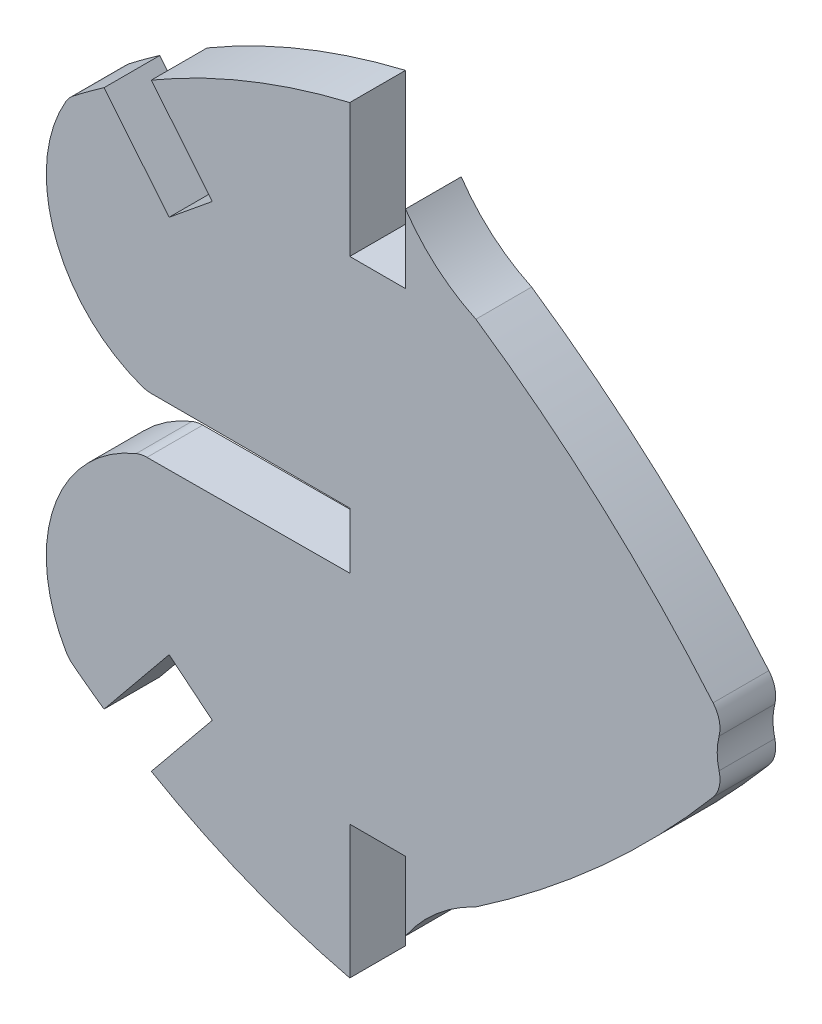
ISO-10303-21;
HEADER;
FILE_DESCRIPTION(('STEP AP214'),'2;1');
FILE_NAME('part.step','',(''),(''),'','','');
FILE_SCHEMA(('AUTOMOTIVE_DESIGN { 1 0 10303 214 1 1 1 1 }'));
ENDSEC;
DATA;
#1=APPLICATION_CONTEXT('core data for automotive mechanical design processes');
#2=APPLICATION_PROTOCOL_DEFINITION('international standard','automotive_design',2000,#1);
#3=PRODUCT_CONTEXT('',#1,'mechanical');
#4=PRODUCT('Part','Part','',(#3));
#5=PRODUCT_RELATED_PRODUCT_CATEGORY('part','',(#4));
#6=PRODUCT_DEFINITION_FORMATION('','',#4);
#7=PRODUCT_DEFINITION_CONTEXT('part definition',#1,'design');
#8=PRODUCT_DEFINITION('design','',#6,#7);
#9=PRODUCT_DEFINITION_SHAPE('','',#8);
#10=(LENGTH_UNIT() NAMED_UNIT(*) SI_UNIT(.MILLI.,.METRE.));
#11=(NAMED_UNIT(*) PLANE_ANGLE_UNIT() SI_UNIT($,.RADIAN.));
#12=(NAMED_UNIT(*) SI_UNIT($,.STERADIAN.) SOLID_ANGLE_UNIT());
#13=UNCERTAINTY_MEASURE_WITH_UNIT(LENGTH_MEASURE(1.E-05),#10,'distance_accuracy_value','');
#14=(GEOMETRIC_REPRESENTATION_CONTEXT(3) GLOBAL_UNCERTAINTY_ASSIGNED_CONTEXT((#13)) GLOBAL_UNIT_ASSIGNED_CONTEXT((#10,
#11,#12)) REPRESENTATION_CONTEXT('',''));
#15=CARTESIAN_POINT('',(0.,0.,0.));
#16=DIRECTION('',(0.,0.,1.));
#17=DIRECTION('',(1.,0.,0.));
#18=AXIS2_PLACEMENT_3D('',#15,#16,#17);
#19=CARTESIAN_POINT('',(70.3517596762299,0.,1.524));
#20=DIRECTION('',(0.,1.,0.));
#21=DIRECTION('',(-1.,0.,0.));
#22=AXIS2_PLACEMENT_3D('',#19,#20,#21);
#23=PLANE('',#22);
#24=DIRECTION('',(1.,0.,0.));
#25=VECTOR('',#24,1.);
#26=CARTESIAN_POINT('',(70.3517596762299,0.,0.));
#27=LINE('',#26,#25);
#28=CARTESIAN_POINT('',(64.9297597579509,0.,0.));
#29=VERTEX_POINT('',#28);
#30=CARTESIAN_POINT('',(70.3517596762299,0.,0.));
#31=VERTEX_POINT('',#30);
#32=EDGE_CURVE('E272',#29,#31,#27,.T.);
#33=ORIENTED_EDGE('',*,*,#32,.T.);
#34=DIRECTION('',(0.,0.,-1.));
#35=VECTOR('',#34,1.);
#36=CARTESIAN_POINT('',(70.3517596762299,0.,1.524));
#37=LINE('',#36,#35);
#38=CARTESIAN_POINT('',(70.3517596762299,0.,1.524));
#39=VERTEX_POINT('',#38);
#40=EDGE_CURVE('E11',#39,#31,#37,.T.);
#41=ORIENTED_EDGE('',*,*,#40,.F.);
#42=DIRECTION('',(1.,0.,0.));
#43=VECTOR('',#42,1.);
#44=CARTESIAN_POINT('',(70.3517596762299,0.,1.524));
#45=LINE('',#44,#43);
#46=CARTESIAN_POINT('',(64.9297597579509,0.,1.524));
#47=VERTEX_POINT('',#46);
#48=EDGE_CURVE('E334',#47,#39,#45,.T.);
#49=ORIENTED_EDGE('',*,*,#48,.F.);
#50=DIRECTION('',(0.,0.,-1.));
#51=VECTOR('',#50,1.);
#52=CARTESIAN_POINT('',(64.9297597579509,0.,1.524));
#53=LINE('',#52,#51);
#54=EDGE_CURVE('E268',#47,#29,#53,.T.);
#55=ORIENTED_EDGE('',*,*,#54,.T.);
#56=EDGE_LOOP('',(#33,#41,#49,#55));
#57=FACE_BOUND('',#56,.T.);
#58=ADVANCED_FACE('F32',(#57),#23,.F.);
#59=CARTESIAN_POINT('',(70.3517596762299,-1.54044228206095,1.524));
#60=DIRECTION('',(1.,0.,0.));
#61=DIRECTION('',(0.,0.,-1.));
#62=AXIS2_PLACEMENT_3D('',#59,#60,#61);
#63=PLANE('',#62);
#64=DIRECTION('',(0.,-1.,0.));
#65=VECTOR('',#64,1.);
#66=CARTESIAN_POINT('',(70.3517596762299,-1.54044228206095,0.));
#67=LINE('',#66,#65);
#68=CARTESIAN_POINT('',(70.3517596762299,-1.54044228206095,0.));
#69=VERTEX_POINT('',#68);
#70=EDGE_CURVE('E275',#31,#69,#67,.T.);
#71=ORIENTED_EDGE('',*,*,#70,.T.);
#72=DIRECTION('',(0.,0.,-1.));
#73=VECTOR('',#72,1.);
#74=CARTESIAN_POINT('',(70.3517596762299,-1.54044228206095,1.524));
#75=LINE('',#74,#73);
#76=CARTESIAN_POINT('',(70.3517596762299,-1.54044228206095,1.524));
#77=VERTEX_POINT('',#76);
#78=EDGE_CURVE('E40',#77,#69,#75,.T.);
#79=ORIENTED_EDGE('',*,*,#78,.F.);
#80=DIRECTION('',(0.,-1.,0.));
#81=VECTOR('',#80,1.);
#82=CARTESIAN_POINT('',(70.3517596762299,-1.54044228206095,1.524));
#83=LINE('',#82,#81);
#84=EDGE_CURVE('E163',#39,#77,#83,.T.);
#85=ORIENTED_EDGE('',*,*,#84,.F.);
#86=ORIENTED_EDGE('',*,*,#40,.T.);
#87=EDGE_LOOP('',(#71,#79,#85,#86));
#88=FACE_BOUND('',#87,.T.);
#89=ADVANCED_FACE('F512',(#88),#63,.F.);
#90=CARTESIAN_POINT('',(70.3517596762299,-1.54044228206095,1.524));
#91=DIRECTION('',(0.00539437100730517,-0.999985450274871,0.));
#92=DIRECTION('',(0.999985450274871,0.00539437100730517,0.));
#93=AXIS2_PLACEMENT_3D('',#90,#91,#92);
#94=PLANE('',#93);
#95=DIRECTION('',(-0.999985450274871,-0.00539437100730517,0.));
#96=VECTOR('',#95,1.);
#97=CARTESIAN_POINT('',(70.3517596762299,-1.54044228206095,0.));
#98=LINE('',#97,#96);
#99=CARTESIAN_POINT('',(64.8048504153923,-1.57036480392223,0.));
#100=VERTEX_POINT('',#99);
#101=EDGE_CURVE('E277',#69,#100,#98,.T.);
#102=ORIENTED_EDGE('',*,*,#101,.T.);
#103=DIRECTION('',(0.,0.,-1.));
#104=VECTOR('',#103,1.);
#105=CARTESIAN_POINT('',(64.8048504153923,-1.57036480392223,1.524));
#106=LINE('',#105,#104);
#107=CARTESIAN_POINT('',(64.8048504153923,-1.57036480392223,1.524));
#108=VERTEX_POINT('',#107);
#109=EDGE_CURVE('E413',#108,#100,#106,.T.);
#110=ORIENTED_EDGE('',*,*,#109,.F.);
#111=DIRECTION('',(-0.999985450274871,-0.00539437100730517,0.));
#112=VECTOR('',#111,1.);
#113=CARTESIAN_POINT('',(70.3517596762299,-1.54044228206095,1.524));
#114=LINE('',#113,#112);
#115=EDGE_CURVE('E421',#77,#108,#114,.T.);
#116=ORIENTED_EDGE('',*,*,#115,.F.);
#117=ORIENTED_EDGE('',*,*,#78,.T.);
#118=EDGE_LOOP('',(#102,#110,#116,#117));
#119=FACE_BOUND('',#118,.T.);
#120=ADVANCED_FACE('F419',(#119),#94,.F.);
#121=CARTESIAN_POINT('',(64.8091321973791,-2.36410325507791,1.524));
#122=DIRECTION('',(0.,0.,-1.));
#123=DIRECTION('',(-1.,0.,0.));
#124=AXIS2_PLACEMENT_3D('',#121,#122,#123);
#125=CYLINDRICAL_SURFACE('',#124,0.793749999999961);
#126=CARTESIAN_POINT('',(64.8091321973791,-2.36410325507791,0.));
#127=DIRECTION('',(0.,0.,1.));
#128=DIRECTION('',(-1.,0.,0.));
#129=AXIS2_PLACEMENT_3D('',#126,#127,#128);
#130=CIRCLE('',#129,0.793749999999961);
#131=CARTESIAN_POINT('',(64.5093015971922,-1.62916062215238,0.));
#132=VERTEX_POINT('',#131);
#133=EDGE_CURVE('E279',#100,#132,#130,.T.);
#134=ORIENTED_EDGE('',*,*,#133,.T.);
#135=DIRECTION('',(0.,0.,-1.));
#136=VECTOR('',#135,1.);
#137=CARTESIAN_POINT('',(64.5093015971922,-1.62916062215238,1.524));
#138=LINE('',#137,#136);
#139=CARTESIAN_POINT('',(64.5093015971922,-1.62916062215238,1.524));
#140=VERTEX_POINT('',#139);
#141=EDGE_CURVE('E410',#140,#132,#138,.T.);
#142=ORIENTED_EDGE('',*,*,#141,.F.);
#143=CARTESIAN_POINT('',(64.8091321973791,-2.36410325507791,1.524));
#144=DIRECTION('',(0.,0.,1.));
#145=DIRECTION('',(-1.,0.,0.));
#146=AXIS2_PLACEMENT_3D('',#143,#144,#145);
#147=CIRCLE('',#146,0.793749999999961);
#148=EDGE_CURVE('E439',#108,#140,#147,.T.);
#149=ORIENTED_EDGE('',*,*,#148,.F.);
#150=ORIENTED_EDGE('',*,*,#109,.T.);
#151=EDGE_LOOP('',(#134,#142,#149,#150));
#152=FACE_BOUND('',#151,.T.);
#153=ADVANCED_FACE('F430',(#152),#125,.T.);
#154=CARTESIAN_POINT('',(66.0008068894287,-5.28512777766143,1.524));
#155=DIRECTION('',(0.,0.,-1.));
#156=DIRECTION('',(-1.,0.,0.));
#157=AXIS2_PLACEMENT_3D('',#154,#155,#156);
#158=CYLINDRICAL_SURFACE('',#157,3.948504005181);
#159=CARTESIAN_POINT('',(66.0008068894287,-5.28512777766143,0.));
#160=DIRECTION('',(0.,0.,1.));
#161=DIRECTION('',(-1.,0.,0.));
#162=AXIS2_PLACEMENT_3D('',#159,#160,#161);
#163=CIRCLE('',#162,3.948504005181);
#164=CARTESIAN_POINT('',(62.5889191130242,-7.27251442352376,0.));
#165=VERTEX_POINT('',#164);
#166=EDGE_CURVE('E281',#132,#165,#163,.T.);
#167=ORIENTED_EDGE('',*,*,#166,.T.);
#168=DIRECTION('',(0.,0.,-1.));
#169=VECTOR('',#168,1.);
#170=CARTESIAN_POINT('',(62.5889191130242,-7.27251442352376,1.524));
#171=LINE('',#170,#169);
#172=CARTESIAN_POINT('',(62.5889191130242,-7.27251442352376,1.524));
#173=VERTEX_POINT('',#172);
#174=EDGE_CURVE('E407',#173,#165,#171,.T.);
#175=ORIENTED_EDGE('',*,*,#174,.F.);
#176=CARTESIAN_POINT('',(66.0008068894287,-5.28512777766143,1.524));
#177=DIRECTION('',(0.,0.,1.));
#178=DIRECTION('',(-1.,0.,0.));
#179=AXIS2_PLACEMENT_3D('',#176,#177,#178);
#180=CIRCLE('',#179,3.948504005181);
#181=EDGE_CURVE('E436',#140,#173,#180,.T.);
#182=ORIENTED_EDGE('',*,*,#181,.F.);
#183=ORIENTED_EDGE('',*,*,#141,.T.);
#184=EDGE_LOOP('',(#167,#175,#182,#183));
#185=FACE_BOUND('',#184,.T.);
#186=ADVANCED_FACE('F434',(#185),#158,.T.);
#187=CARTESIAN_POINT('',(63.2747955662072,-6.87299902523613,1.524));
#188=DIRECTION('',(0.,0.,-1.));
#189=DIRECTION('',(-1.,0.,0.));
#190=AXIS2_PLACEMENT_3D('',#187,#188,#189);
#191=CYLINDRICAL_SURFACE('',#190,0.793749999999911);
#192=CARTESIAN_POINT('',(63.2747955662072,-6.87299902523613,0.));
#193=DIRECTION('',(0.,0.,1.));
#194=DIRECTION('',(1.,0.,0.));
#195=AXIS2_PLACEMENT_3D('',#192,#193,#194);
#196=CIRCLE('',#195,0.793749999999911);
#197=CARTESIAN_POINT('',(62.7882508910903,-7.50014601089041,0.));
#198=VERTEX_POINT('',#197);
#199=EDGE_CURVE('E283',#165,#198,#196,.T.);
#200=ORIENTED_EDGE('',*,*,#199,.T.);
#201=DIRECTION('',(0.,0.,-1.));
#202=VECTOR('',#201,1.);
#203=CARTESIAN_POINT('',(62.7882508910903,-7.50014601089041,1.524));
#204=LINE('',#203,#202);
#205=CARTESIAN_POINT('',(62.7882508910903,-7.50014601089041,1.524));
#206=VERTEX_POINT('',#205);
#207=EDGE_CURVE('E404',#206,#198,#204,.T.);
#208=ORIENTED_EDGE('',*,*,#207,.F.);
#209=CARTESIAN_POINT('',(63.2747955662072,-6.87299902523613,1.524));
#210=DIRECTION('',(0.,0.,1.));
#211=DIRECTION('',(1.,0.,0.));
#212=AXIS2_PLACEMENT_3D('',#209,#210,#211);
#213=CIRCLE('',#212,0.793749999999911);
#214=EDGE_CURVE('E438',#173,#206,#213,.T.);
#215=ORIENTED_EDGE('',*,*,#214,.F.);
#216=ORIENTED_EDGE('',*,*,#174,.T.);
#217=EDGE_LOOP('',(#200,#208,#215,#216));
#218=FACE_BOUND('',#217,.T.);
#219=ADVANCED_FACE('F525',(#218),#191,.T.);
#220=CARTESIAN_POINT('',(74.9681905245007,8.19956835410937,1.524));
#221=DIRECTION('',(0.,0.,-1.));
#222=DIRECTION('',(-1.,0.,0.));
#223=AXIS2_PLACEMENT_3D('',#220,#221,#222);
#224=CYLINDRICAL_SURFACE('',#223,19.8703789751504);
#225=CARTESIAN_POINT('',(74.9681905245007,8.19956835410937,0.));
#226=DIRECTION('',(0.,0.,1.));
#227=DIRECTION('',(-1.,0.,0.));
#228=AXIS2_PLACEMENT_3D('',#225,#226,#227);
#229=CIRCLE('',#228,19.8703789751504);
#230=CARTESIAN_POINT('',(63.6315216804938,-8.11949718707355,0.));
#231=VERTEX_POINT('',#230);
#232=EDGE_CURVE('E285',#198,#231,#229,.T.);
#233=ORIENTED_EDGE('',*,*,#232,.T.);
#234=DIRECTION('',(0.,0.,-1.));
#235=VECTOR('',#234,1.);
#236=CARTESIAN_POINT('',(63.6315216804938,-8.11949718707355,1.524));
#237=LINE('',#236,#235);
#238=CARTESIAN_POINT('',(63.6315216804938,-8.11949718707355,1.524));
#239=VERTEX_POINT('',#238);
#240=EDGE_CURVE('E401',#239,#231,#237,.T.);
#241=ORIENTED_EDGE('',*,*,#240,.F.);
#242=CARTESIAN_POINT('',(74.9681905245007,8.19956835410937,1.524));
#243=DIRECTION('',(0.,0.,1.));
#244=DIRECTION('',(-1.,0.,0.));
#245=AXIS2_PLACEMENT_3D('',#242,#243,#244);
#246=CIRCLE('',#245,19.8703789751504);
#247=EDGE_CURVE('E441',#206,#239,#246,.T.);
#248=ORIENTED_EDGE('',*,*,#247,.F.);
#249=ORIENTED_EDGE('',*,*,#207,.T.);
#250=EDGE_LOOP('',(#233,#241,#248,#249));
#251=FACE_BOUND('',#250,.T.);
#252=ADVANCED_FACE('F528',(#251),#224,.T.);
#253=CARTESIAN_POINT('',(63.6315216804938,-8.11949718707355,1.524));
#254=DIRECTION('',(-0.774608961273237,0.632440477132194,0.));
#255=DIRECTION('',(-0.632440477132194,-0.774608961273237,0.));
#256=AXIS2_PLACEMENT_3D('',#253,#254,#255);
#257=PLANE('',#256);
#258=DIRECTION('',(0.632440477132194,0.774608961273237,0.));
#259=VECTOR('',#258,1.);
#260=CARTESIAN_POINT('',(63.6315216804938,-8.11949718707355,0.));
#261=LINE('',#260,#259);
#262=CARTESIAN_POINT('',(65.410554860862,-5.94054897970317,0.));
#263=VERTEX_POINT('',#262);
#264=EDGE_CURVE('E287',#231,#263,#261,.T.);
#265=ORIENTED_EDGE('',*,*,#264,.T.);
#266=DIRECTION('',(0.,0.,-1.));
#267=VECTOR('',#266,1.);
#268=CARTESIAN_POINT('',(65.410554860862,-5.94054897970317,1.524));
#269=LINE('',#268,#267);
#270=CARTESIAN_POINT('',(65.410554860862,-5.94054897970317,1.524));
#271=VERTEX_POINT('',#270);
#272=EDGE_CURVE('E398',#271,#263,#269,.T.);
#273=ORIENTED_EDGE('',*,*,#272,.F.);
#274=DIRECTION('',(0.632440477132194,0.774608961273237,0.));
#275=VECTOR('',#274,1.);
#276=CARTESIAN_POINT('',(63.6315216804938,-8.11949718707355,1.524));
#277=LINE('',#276,#275);
#278=EDGE_CURVE('E447',#239,#271,#277,.T.);
#279=ORIENTED_EDGE('',*,*,#278,.F.);
#280=ORIENTED_EDGE('',*,*,#240,.T.);
#281=EDGE_LOOP('',(#265,#273,#279,#280));
#282=FACE_BOUND('',#281,.T.);
#283=ADVANCED_FACE('F532',(#282),#257,.F.);
#284=CARTESIAN_POINT('',(65.410554860862,-5.94054897970317,1.524));
#285=DIRECTION('',(0.632440477132194,0.774608961273237,0.));
#286=DIRECTION('',(-0.774608961273237,0.632440477132194,0.));
#287=AXIS2_PLACEMENT_3D('',#284,#285,#286);
#288=PLANE('',#287);
#289=DIRECTION('',(0.774608961273237,-0.632440477132194,0.));
#290=VECTOR('',#289,1.);
#291=CARTESIAN_POINT('',(65.410554860862,-5.94054897970317,0.));
#292=LINE('',#291,#290);
#293=CARTESIAN_POINT('',(66.5910589178424,-6.90438826685263,0.));
#294=VERTEX_POINT('',#293);
#295=EDGE_CURVE('E289',#263,#294,#292,.T.);
#296=ORIENTED_EDGE('',*,*,#295,.T.);
#297=DIRECTION('',(0.,0.,-1.));
#298=VECTOR('',#297,1.);
#299=CARTESIAN_POINT('',(66.5910589178424,-6.90438826685263,1.524));
#300=LINE('',#299,#298);
#301=CARTESIAN_POINT('',(66.5910589178424,-6.90438826685263,1.524));
#302=VERTEX_POINT('',#301);
#303=EDGE_CURVE('E395',#302,#294,#300,.T.);
#304=ORIENTED_EDGE('',*,*,#303,.F.);
#305=DIRECTION('',(0.774608961273237,-0.632440477132194,0.));
#306=VECTOR('',#305,1.);
#307=CARTESIAN_POINT('',(65.410554860862,-5.94054897970317,1.524));
#308=LINE('',#307,#306);
#309=EDGE_CURVE('E449',#271,#302,#308,.T.);
#310=ORIENTED_EDGE('',*,*,#309,.F.);
#311=ORIENTED_EDGE('',*,*,#272,.T.);
#312=EDGE_LOOP('',(#296,#304,#310,#311));
#313=FACE_BOUND('',#312,.T.);
#314=ADVANCED_FACE('F536',(#313),#288,.F.);
#315=CARTESIAN_POINT('',(64.9244972195025,-8.94558213841285,1.524));
#316=DIRECTION('',(0.774608961273239,-0.632440477132191,0.));
#317=DIRECTION('',(0.632440477132191,0.774608961273239,0.));
#318=AXIS2_PLACEMENT_3D('',#315,#316,#317);
#319=PLANE('',#318);
#320=DIRECTION('',(-0.632440477132191,-0.774608961273239,0.));
#321=VECTOR('',#320,1.);
#322=CARTESIAN_POINT('',(64.9244972195025,-8.94558213841285,0.));
#323=LINE('',#322,#321);
#324=CARTESIAN_POINT('',(64.9244972195025,-8.94558213841285,0.));
#325=VERTEX_POINT('',#324);
#326=EDGE_CURVE('E291',#294,#325,#323,.T.);
#327=ORIENTED_EDGE('',*,*,#326,.T.);
#328=DIRECTION('',(0.,0.,-1.));
#329=VECTOR('',#328,1.);
#330=CARTESIAN_POINT('',(64.9244972195025,-8.94558213841285,1.524));
#331=LINE('',#330,#329);
#332=CARTESIAN_POINT('',(64.9244972195025,-8.94558213841285,1.524));
#333=VERTEX_POINT('',#332);
#334=EDGE_CURVE('E392',#333,#325,#331,.T.);
#335=ORIENTED_EDGE('',*,*,#334,.F.);
#336=DIRECTION('',(-0.632440477132191,-0.774608961273239,0.));
#337=VECTOR('',#336,1.);
#338=CARTESIAN_POINT('',(64.9244972195025,-8.94558213841285,1.524));
#339=LINE('',#338,#337);
#340=EDGE_CURVE('E451',#302,#333,#339,.T.);
#341=ORIENTED_EDGE('',*,*,#340,.F.);
#342=ORIENTED_EDGE('',*,*,#303,.T.);
#343=EDGE_LOOP('',(#327,#335,#341,#342));
#344=FACE_BOUND('',#343,.T.);
#345=ADVANCED_FACE('F540',(#344),#319,.F.);
#346=CARTESIAN_POINT('',(74.9681905245007,8.19956835410937,1.524));
#347=DIRECTION('',(0.,0.,-1.));
#348=DIRECTION('',(-1.,0.,0.));
#349=AXIS2_PLACEMENT_3D('',#346,#347,#348);
#350=CYLINDRICAL_SURFACE('',#349,19.8703789751504);
#351=CARTESIAN_POINT('',(74.9681905245007,8.19956835410937,0.));
#352=DIRECTION('',(0.,0.,1.));
#353=DIRECTION('',(-1.,0.,0.));
#354=AXIS2_PLACEMENT_3D('',#351,#352,#353);
#355=CIRCLE('',#354,19.8703789751504);
#356=CARTESIAN_POINT('',(70.349637053648,-11.1266036531189,0.));
#357=VERTEX_POINT('',#356);
#358=EDGE_CURVE('E293',#325,#357,#355,.T.);
#359=ORIENTED_EDGE('',*,*,#358,.T.);
#360=DIRECTION('',(0.,0.,-1.));
#361=VECTOR('',#360,1.);
#362=CARTESIAN_POINT('',(70.349637053648,-11.1266036531189,1.524));
#363=LINE('',#362,#361);
#364=CARTESIAN_POINT('',(70.349637053648,-11.1266036531189,1.524));
#365=VERTEX_POINT('',#364);
#366=EDGE_CURVE('E389',#365,#357,#363,.T.);
#367=ORIENTED_EDGE('',*,*,#366,.F.);
#368=CARTESIAN_POINT('',(74.9681905245007,8.19956835410937,1.524));
#369=DIRECTION('',(0.,0.,1.));
#370=DIRECTION('',(-1.,0.,0.));
#371=AXIS2_PLACEMENT_3D('',#368,#369,#370);
#372=CIRCLE('',#371,19.8703789751504);
#373=EDGE_CURVE('E453',#333,#365,#372,.T.);
#374=ORIENTED_EDGE('',*,*,#373,.F.);
#375=ORIENTED_EDGE('',*,*,#334,.T.);
#376=EDGE_LOOP('',(#359,#367,#374,#375));
#377=FACE_BOUND('',#376,.T.);
#378=ADVANCED_FACE('F544',(#377),#350,.T.);
#379=CARTESIAN_POINT('',(70.349637053648,-11.1266036531189,1.524));
#380=DIRECTION('',(-1.,0.,0.));
#381=DIRECTION('',(0.,0.,1.));
#382=AXIS2_PLACEMENT_3D('',#379,#380,#381);
#383=PLANE('',#382);
#384=DIRECTION('',(0.,1.,0.));
#385=VECTOR('',#384,1.);
#386=CARTESIAN_POINT('',(70.349637053648,-11.1266036531189,0.));
#387=LINE('',#386,#385);
#388=CARTESIAN_POINT('',(70.349637053648,-7.48296754921924,0.));
#389=VERTEX_POINT('',#388);
#390=EDGE_CURVE('E295',#357,#389,#387,.T.);
#391=ORIENTED_EDGE('',*,*,#390,.T.);
#392=DIRECTION('',(0.,0.,-1.));
#393=VECTOR('',#392,1.);
#394=CARTESIAN_POINT('',(70.349637053648,-7.48296754921924,1.524));
#395=LINE('',#394,#393);
#396=CARTESIAN_POINT('',(70.349637053648,-7.48296754921924,1.524));
#397=VERTEX_POINT('',#396);
#398=EDGE_CURVE('E386',#397,#389,#395,.T.);
#399=ORIENTED_EDGE('',*,*,#398,.F.);
#400=DIRECTION('',(0.,1.,0.));
#401=VECTOR('',#400,1.);
#402=CARTESIAN_POINT('',(70.349637053648,-11.1266036531189,1.524));
#403=LINE('',#402,#401);
#404=EDGE_CURVE('E455',#365,#397,#403,.T.);
#405=ORIENTED_EDGE('',*,*,#404,.F.);
#406=ORIENTED_EDGE('',*,*,#366,.T.);
#407=EDGE_LOOP('',(#391,#399,#405,#406));
#408=FACE_BOUND('',#407,.T.);
#409=ADVANCED_FACE('F548',(#408),#383,.F.);
#410=CARTESIAN_POINT('',(71.873637053648,-7.48296754921924,1.524));
#411=DIRECTION('',(0.,1.,0.));
#412=DIRECTION('',(0.,0.,1.));
#413=AXIS2_PLACEMENT_3D('',#410,#411,#412);
#414=PLANE('',#413);
#415=DIRECTION('',(1.,0.,0.));
#416=VECTOR('',#415,1.);
#417=CARTESIAN_POINT('',(71.873637053648,-7.48296754921924,0.));
#418=LINE('',#417,#416);
#419=CARTESIAN_POINT('',(71.873637053648,-7.48296754921924,0.));
#420=VERTEX_POINT('',#419);
#421=EDGE_CURVE('E297',#389,#420,#418,.T.);
#422=ORIENTED_EDGE('',*,*,#421,.T.);
#423=DIRECTION('',(0.,0.,-1.));
#424=VECTOR('',#423,1.);
#425=CARTESIAN_POINT('',(71.873637053648,-7.48296754921924,1.524));
#426=LINE('',#425,#424);
#427=CARTESIAN_POINT('',(71.873637053648,-7.48296754921924,1.524));
#428=VERTEX_POINT('',#427);
#429=EDGE_CURVE('E383',#428,#420,#426,.T.);
#430=ORIENTED_EDGE('',*,*,#429,.F.);
#431=DIRECTION('',(1.,0.,0.));
#432=VECTOR('',#431,1.);
#433=CARTESIAN_POINT('',(71.873637053648,-7.48296754921924,1.524));
#434=LINE('',#433,#432);
#435=EDGE_CURVE('E457',#397,#428,#434,.T.);
#436=ORIENTED_EDGE('',*,*,#435,.F.);
#437=ORIENTED_EDGE('',*,*,#398,.T.);
#438=EDGE_LOOP('',(#422,#430,#436,#437));
#439=FACE_BOUND('',#438,.T.);
#440=ADVANCED_FACE('F552',(#439),#414,.F.);
#441=CARTESIAN_POINT('',(71.873637053648,-9.36835651136685,1.524));
#442=DIRECTION('',(1.,0.,0.));
#443=DIRECTION('',(0.,0.,-1.));
#444=AXIS2_PLACEMENT_3D('',#441,#442,#443);
#445=PLANE('',#444);
#446=DIRECTION('',(0.,-1.,0.));
#447=VECTOR('',#446,1.);
#448=CARTESIAN_POINT('',(71.873637053648,-9.36835651136685,0.));
#449=LINE('',#448,#447);
#450=CARTESIAN_POINT('',(71.873637053648,-9.36835651136685,0.));
#451=VERTEX_POINT('',#450);
#452=EDGE_CURVE('E299',#420,#451,#449,.T.);
#453=ORIENTED_EDGE('',*,*,#452,.T.);
#454=DIRECTION('',(0.,0.,-1.));
#455=VECTOR('',#454,1.);
#456=CARTESIAN_POINT('',(71.873637053648,-9.36835651136685,1.524));
#457=LINE('',#456,#455);
#458=CARTESIAN_POINT('',(71.873637053648,-9.36835651136685,1.524));
#459=VERTEX_POINT('',#458);
#460=EDGE_CURVE('E380',#459,#451,#457,.T.);
#461=ORIENTED_EDGE('',*,*,#460,.F.);
#462=DIRECTION('',(0.,-1.,0.));
#463=VECTOR('',#462,1.);
#464=CARTESIAN_POINT('',(71.873637053648,-9.36835651136685,1.524));
#465=LINE('',#464,#463);
#466=EDGE_CURVE('E459',#428,#459,#465,.T.);
#467=ORIENTED_EDGE('',*,*,#466,.F.);
#468=ORIENTED_EDGE('',*,*,#429,.T.);
#469=EDGE_LOOP('',(#453,#461,#467,#468));
#470=FACE_BOUND('',#469,.T.);
#471=ADVANCED_FACE('F556',(#470),#445,.F.);
#472=CARTESIAN_POINT('',(75.8398417054369,-12.0518253612268,1.524));
#473=DIRECTION('',(0.,0.,-1.));
#474=DIRECTION('',(-1.,0.,0.));
#475=AXIS2_PLACEMENT_3D('',#472,#473,#474);
#476=CYLINDRICAL_SURFACE('',#475,4.78871427504705);
#477=CARTESIAN_POINT('',(75.8398417054369,-12.0518253612268,0.));
#478=DIRECTION('',(0.,0.,-1.));
#479=DIRECTION('',(1.,0.,0.));
#480=AXIS2_PLACEMENT_3D('',#477,#478,#479);
#481=CIRCLE('',#480,4.78871427504705);
#482=CARTESIAN_POINT('',(73.7975396419488,-7.72045298177108,0.));
#483=VERTEX_POINT('',#482);
#484=EDGE_CURVE('E301',#451,#483,#481,.T.);
#485=ORIENTED_EDGE('',*,*,#484,.T.);
#486=DIRECTION('',(0.,0.,-1.));
#487=VECTOR('',#486,1.);
#488=CARTESIAN_POINT('',(73.7975396419488,-7.72045298177108,1.524));
#489=LINE('',#488,#487);
#490=CARTESIAN_POINT('',(73.7975396419488,-7.72045298177108,1.524));
#491=VERTEX_POINT('',#490);
#492=EDGE_CURVE('E377',#491,#483,#489,.T.);
#493=ORIENTED_EDGE('',*,*,#492,.F.);
#494=CARTESIAN_POINT('',(75.8398417054369,-12.0518253612268,1.524));
#495=DIRECTION('',(0.,0.,-1.));
#496=DIRECTION('',(1.,0.,0.));
#497=AXIS2_PLACEMENT_3D('',#494,#495,#496);
#498=CIRCLE('',#497,4.78871427504705);
#499=EDGE_CURVE('E461',#459,#491,#498,.T.);
#500=ORIENTED_EDGE('',*,*,#499,.F.);
#501=ORIENTED_EDGE('',*,*,#460,.T.);
#502=EDGE_LOOP('',(#485,#493,#500,#501));
#503=FACE_BOUND('',#502,.T.);
#504=ADVANCED_FACE('F560',(#503),#476,.F.);
#505=CARTESIAN_POINT('',(55.604244703539,19.0045916556661,1.524));
#506=DIRECTION('',(0.,0.,-1.));
#507=DIRECTION('',(-1.,0.,0.));
#508=AXIS2_PLACEMENT_3D('',#505,#506,#507);
#509=CYLINDRICAL_SURFACE('',#508,32.3299240888221);
#510=CARTESIAN_POINT('',(55.604244703539,19.0045916556661,0.));
#511=DIRECTION('',(0.,0.,1.));
#512=DIRECTION('',(1.,0.,0.));
#513=AXIS2_PLACEMENT_3D('',#510,#511,#512);
#514=CIRCLE('',#513,32.3299240888221);
#515=CARTESIAN_POINT('',(80.2835558518823,-1.87974680242864,0.));
#516=VERTEX_POINT('',#515);
#517=EDGE_CURVE('E303',#483,#516,#514,.T.);
#518=ORIENTED_EDGE('',*,*,#517,.T.);
#519=DIRECTION('',(0.,0.,-1.));
#520=VECTOR('',#519,1.);
#521=CARTESIAN_POINT('',(80.2835558518823,-1.87974680242864,1.524));
#522=LINE('',#521,#520);
#523=CARTESIAN_POINT('',(80.2835558518823,-1.87974680242864,1.524));
#524=VERTEX_POINT('',#523);
#525=EDGE_CURVE('E374',#524,#516,#522,.T.);
#526=ORIENTED_EDGE('',*,*,#525,.F.);
#527=CARTESIAN_POINT('',(55.604244703539,19.0045916556661,1.524));
#528=DIRECTION('',(0.,0.,1.));
#529=DIRECTION('',(1.,0.,0.));
#530=AXIS2_PLACEMENT_3D('',#527,#528,#529);
#531=CIRCLE('',#530,32.3299240888221);
#532=EDGE_CURVE('E463',#491,#524,#531,.T.);
#533=ORIENTED_EDGE('',*,*,#532,.F.);
#534=ORIENTED_EDGE('',*,*,#492,.T.);
#535=EDGE_LOOP('',(#518,#526,#533,#534));
#536=FACE_BOUND('',#535,.T.);
#537=ADVANCED_FACE('F564',(#536),#509,.T.);
#538=CARTESIAN_POINT('',(79.6776403177111,-1.36700375961889,1.524));
#539=DIRECTION('',(0.,0.,-1.));
#540=DIRECTION('',(-1.,0.,0.));
#541=AXIS2_PLACEMENT_3D('',#538,#539,#540);
#542=CYLINDRICAL_SURFACE('',#541,0.793750000000005);
#543=CARTESIAN_POINT('',(79.6776403177111,-1.36700375961889,0.));
#544=DIRECTION('',(0.,0.,1.));
#545=DIRECTION('',(1.,0.,0.));
#546=AXIS2_PLACEMENT_3D('',#543,#544,#545);
#547=CIRCLE('',#546,0.793750000000005);
#548=CARTESIAN_POINT('',(80.4470170188281,-1.17181525002305,0.));
#549=VERTEX_POINT('',#548);
#550=EDGE_CURVE('E305',#516,#549,#547,.T.);
#551=ORIENTED_EDGE('',*,*,#550,.T.);
#552=DIRECTION('',(0.,0.,-1.));
#553=VECTOR('',#552,1.);
#554=CARTESIAN_POINT('',(80.4470170188281,-1.17181525002305,1.524));
#555=LINE('',#554,#553);
#556=CARTESIAN_POINT('',(80.4470170188281,-1.17181525002305,1.524));
#557=VERTEX_POINT('',#556);
#558=EDGE_CURVE('E371',#557,#549,#555,.T.);
#559=ORIENTED_EDGE('',*,*,#558,.F.);
#560=CARTESIAN_POINT('',(79.6776403177111,-1.36700375961889,1.524));
#561=DIRECTION('',(0.,0.,1.));
#562=DIRECTION('',(1.,0.,0.));
#563=AXIS2_PLACEMENT_3D('',#560,#561,#562);
#564=CIRCLE('',#563,0.793750000000005);
#565=EDGE_CURVE('E465',#524,#557,#564,.T.);
#566=ORIENTED_EDGE('',*,*,#565,.F.);
#567=ORIENTED_EDGE('',*,*,#525,.T.);
#568=EDGE_LOOP('',(#551,#559,#566,#567));
#569=FACE_BOUND('',#568,.T.);
#570=ADVANCED_FACE('F568',(#569),#542,.T.);
#571=CARTESIAN_POINT('',(82.0623903099253,-0.762,1.524));
#572=DIRECTION('',(0.,0.,-1.));
#573=DIRECTION('',(-1.,0.,0.));
#574=AXIS2_PLACEMENT_3D('',#571,#572,#573);
#575=CYLINDRICAL_SURFACE('',#574,1.66654715167071);
#576=CARTESIAN_POINT('',(82.0623903099253,-0.762,0.));
#577=DIRECTION('',(0.,0.,-1.));
#578=DIRECTION('',(-1.,0.,0.));
#579=AXIS2_PLACEMENT_3D('',#576,#577,#578);
#580=CIRCLE('',#579,1.66654715167071);
#581=CARTESIAN_POINT('',(80.4470170188281,-0.352184749976949,0.));
#582=VERTEX_POINT('',#581);
#583=EDGE_CURVE('E307',#549,#582,#580,.T.);
#584=ORIENTED_EDGE('',*,*,#583,.T.);
#585=DIRECTION('',(0.,0.,-1.));
#586=VECTOR('',#585,1.);
#587=CARTESIAN_POINT('',(80.4470170188281,-0.352184749976949,1.524));
#588=LINE('',#587,#586);
#589=CARTESIAN_POINT('',(80.4470170188281,-0.352184749976949,1.524));
#590=VERTEX_POINT('',#589);
#591=EDGE_CURVE('E368',#590,#582,#588,.T.);
#592=ORIENTED_EDGE('',*,*,#591,.F.);
#593=CARTESIAN_POINT('',(82.0623903099253,-0.762,1.524));
#594=DIRECTION('',(0.,0.,-1.));
#595=DIRECTION('',(-1.,0.,0.));
#596=AXIS2_PLACEMENT_3D('',#593,#594,#595);
#597=CIRCLE('',#596,1.66654715167071);
#598=EDGE_CURVE('E467',#557,#590,#597,.T.);
#599=ORIENTED_EDGE('',*,*,#598,.F.);
#600=ORIENTED_EDGE('',*,*,#558,.T.);
#601=EDGE_LOOP('',(#584,#592,#599,#600));
#602=FACE_BOUND('',#601,.T.);
#603=ADVANCED_FACE('F572',(#602),#575,.F.);
#604=CARTESIAN_POINT('',(79.6776403177111,-0.156996240381111,1.524));
#605=DIRECTION('',(0.,0.,-1.));
#606=DIRECTION('',(-1.,0.,0.));
#607=AXIS2_PLACEMENT_3D('',#604,#605,#606);
#608=CYLINDRICAL_SURFACE('',#607,0.793750000000005);
#609=CARTESIAN_POINT('',(79.6776403177111,-0.156996240381111,0.));
#610=DIRECTION('',(0.,0.,1.));
#611=DIRECTION('',(-1.,0.,0.));
#612=AXIS2_PLACEMENT_3D('',#609,#610,#611);
#613=CIRCLE('',#612,0.793750000000005);
#614=CARTESIAN_POINT('',(80.2835558518824,0.355746802428731,0.));
#615=VERTEX_POINT('',#614);
#616=EDGE_CURVE('E309',#582,#615,#613,.T.);
#617=ORIENTED_EDGE('',*,*,#616,.T.);
#618=DIRECTION('',(0.,0.,-1.));
#619=VECTOR('',#618,1.);
#620=CARTESIAN_POINT('',(80.2835558518824,0.355746802428731,1.524));
#621=LINE('',#620,#619);
#622=CARTESIAN_POINT('',(80.2835558518824,0.355746802428731,1.524));
#623=VERTEX_POINT('',#622);
#624=EDGE_CURVE('E365',#623,#615,#621,.T.);
#625=ORIENTED_EDGE('',*,*,#624,.F.);
#626=CARTESIAN_POINT('',(79.6776403177111,-0.156996240381111,1.524));
#627=DIRECTION('',(0.,0.,1.));
#628=DIRECTION('',(-1.,0.,0.));
#629=AXIS2_PLACEMENT_3D('',#626,#627,#628);
#630=CIRCLE('',#629,0.793750000000005);
#631=EDGE_CURVE('E469',#590,#623,#630,.T.);
#632=ORIENTED_EDGE('',*,*,#631,.F.);
#633=ORIENTED_EDGE('',*,*,#591,.T.);
#634=EDGE_LOOP('',(#617,#625,#632,#633));
#635=FACE_BOUND('',#634,.T.);
#636=ADVANCED_FACE('F576',(#635),#608,.T.);
#637=CARTESIAN_POINT('',(55.604244703539,-20.5285916556661,1.524));
#638=DIRECTION('',(0.,0.,-1.));
#639=DIRECTION('',(-1.,0.,0.));
#640=AXIS2_PLACEMENT_3D('',#637,#638,#639);
#641=CYLINDRICAL_SURFACE('',#640,32.3299240888221);
#642=CARTESIAN_POINT('',(55.604244703539,-20.5285916556661,0.));
#643=DIRECTION('',(0.,0.,1.));
#644=DIRECTION('',(-1.,0.,0.));
#645=AXIS2_PLACEMENT_3D('',#642,#643,#644);
#646=CIRCLE('',#645,32.3299240888221);
#647=CARTESIAN_POINT('',(73.797539641949,6.1964529817713,0.));
#648=VERTEX_POINT('',#647);
#649=EDGE_CURVE('E311',#615,#648,#646,.T.);
#650=ORIENTED_EDGE('',*,*,#649,.T.);
#651=DIRECTION('',(0.,0.,-1.));
#652=VECTOR('',#651,1.);
#653=CARTESIAN_POINT('',(73.797539641949,6.1964529817713,1.524));
#654=LINE('',#653,#652);
#655=CARTESIAN_POINT('',(73.797539641949,6.1964529817713,1.524));
#656=VERTEX_POINT('',#655);
#657=EDGE_CURVE('E362',#656,#648,#654,.T.);
#658=ORIENTED_EDGE('',*,*,#657,.F.);
#659=CARTESIAN_POINT('',(55.604244703539,-20.5285916556661,1.524));
#660=DIRECTION('',(0.,0.,1.));
#661=DIRECTION('',(-1.,0.,0.));
#662=AXIS2_PLACEMENT_3D('',#659,#660,#661);
#663=CIRCLE('',#662,32.3299240888221);
#664=EDGE_CURVE('E471',#623,#656,#663,.T.);
#665=ORIENTED_EDGE('',*,*,#664,.F.);
#666=ORIENTED_EDGE('',*,*,#624,.T.);
#667=EDGE_LOOP('',(#650,#658,#665,#666));
#668=FACE_BOUND('',#667,.T.);
#669=ADVANCED_FACE('F580',(#668),#641,.T.);
#670=CARTESIAN_POINT('',(75.8398417054369,10.5278253612268,1.524));
#671=DIRECTION('',(0.,0.,-1.));
#672=DIRECTION('',(-1.,0.,0.));
#673=AXIS2_PLACEMENT_3D('',#670,#671,#672);
#674=CYLINDRICAL_SURFACE('',#673,4.78871427504705);
#675=CARTESIAN_POINT('',(75.8398417054369,10.5278253612268,0.));
#676=DIRECTION('',(0.,0.,-1.));
#677=DIRECTION('',(-1.,0.,0.));
#678=AXIS2_PLACEMENT_3D('',#675,#676,#677);
#679=CIRCLE('',#678,4.78871427504705);
#680=CARTESIAN_POINT('',(71.8736370536481,7.8443565113669,0.));
#681=VERTEX_POINT('',#680);
#682=EDGE_CURVE('E313',#648,#681,#679,.T.);
#683=ORIENTED_EDGE('',*,*,#682,.T.);
#684=DIRECTION('',(0.,0.,-1.));
#685=VECTOR('',#684,1.);
#686=CARTESIAN_POINT('',(71.8736370536481,7.8443565113669,1.524));
#687=LINE('',#686,#685);
#688=CARTESIAN_POINT('',(71.8736370536481,7.8443565113669,1.524));
#689=VERTEX_POINT('',#688);
#690=EDGE_CURVE('E359',#689,#681,#687,.T.);
#691=ORIENTED_EDGE('',*,*,#690,.F.);
#692=CARTESIAN_POINT('',(75.8398417054369,10.5278253612268,1.524));
#693=DIRECTION('',(0.,0.,-1.));
#694=DIRECTION('',(-1.,0.,0.));
#695=AXIS2_PLACEMENT_3D('',#692,#693,#694);
#696=CIRCLE('',#695,4.78871427504705);
#697=EDGE_CURVE('E473',#656,#689,#696,.T.);
#698=ORIENTED_EDGE('',*,*,#697,.F.);
#699=ORIENTED_EDGE('',*,*,#657,.T.);
#700=EDGE_LOOP('',(#683,#691,#698,#699));
#701=FACE_BOUND('',#700,.T.);
#702=ADVANCED_FACE('F584',(#701),#674,.F.);
#703=CARTESIAN_POINT('',(71.873637053648,7.84435651136683,1.524));
#704=DIRECTION('',(1.,0.,0.));
#705=DIRECTION('',(0.,0.,-1.));
#706=AXIS2_PLACEMENT_3D('',#703,#704,#705);
#707=PLANE('',#706);
#708=DIRECTION('',(0.,-1.,0.));
#709=VECTOR('',#708,1.);
#710=CARTESIAN_POINT('',(71.873637053648,7.84435651136683,0.));
#711=LINE('',#710,#709);
#712=CARTESIAN_POINT('',(71.873637053648,5.95896754921924,0.));
#713=VERTEX_POINT('',#712);
#714=EDGE_CURVE('E315',#681,#713,#711,.T.);
#715=ORIENTED_EDGE('',*,*,#714,.T.);
#716=DIRECTION('',(0.,0.,-1.));
#717=VECTOR('',#716,1.);
#718=CARTESIAN_POINT('',(71.873637053648,5.95896754921924,1.524));
#719=LINE('',#718,#717);
#720=CARTESIAN_POINT('',(71.873637053648,5.95896754921924,1.524));
#721=VERTEX_POINT('',#720);
#722=EDGE_CURVE('E356',#721,#713,#719,.T.);
#723=ORIENTED_EDGE('',*,*,#722,.F.);
#724=DIRECTION('',(0.,-1.,0.));
#725=VECTOR('',#724,1.);
#726=CARTESIAN_POINT('',(71.873637053648,7.84435651136683,1.524));
#727=LINE('',#726,#725);
#728=EDGE_CURVE('E475',#689,#721,#727,.T.);
#729=ORIENTED_EDGE('',*,*,#728,.F.);
#730=ORIENTED_EDGE('',*,*,#690,.T.);
#731=EDGE_LOOP('',(#715,#723,#729,#730));
#732=FACE_BOUND('',#731,.T.);
#733=ADVANCED_FACE('F588',(#732),#707,.F.);
#734=CARTESIAN_POINT('',(70.349637053648,5.95896754921924,1.524));
#735=DIRECTION('',(0.,-1.,0.));
#736=DIRECTION('',(0.,0.,-1.));
#737=AXIS2_PLACEMENT_3D('',#734,#735,#736);
#738=PLANE('',#737);
#739=DIRECTION('',(-1.,0.,0.));
#740=VECTOR('',#739,1.);
#741=CARTESIAN_POINT('',(70.349637053648,5.95896754921924,0.));
#742=LINE('',#741,#740);
#743=CARTESIAN_POINT('',(70.349637053648,5.95896754921924,0.));
#744=VERTEX_POINT('',#743);
#745=EDGE_CURVE('E317',#713,#744,#742,.T.);
#746=ORIENTED_EDGE('',*,*,#745,.T.);
#747=DIRECTION('',(0.,0.,-1.));
#748=VECTOR('',#747,1.);
#749=CARTESIAN_POINT('',(70.349637053648,5.95896754921924,1.524));
#750=LINE('',#749,#748);
#751=CARTESIAN_POINT('',(70.349637053648,5.95896754921924,1.524));
#752=VERTEX_POINT('',#751);
#753=EDGE_CURVE('E353',#752,#744,#750,.T.);
#754=ORIENTED_EDGE('',*,*,#753,.F.);
#755=DIRECTION('',(-1.,0.,0.));
#756=VECTOR('',#755,1.);
#757=CARTESIAN_POINT('',(70.349637053648,5.95896754921924,1.524));
#758=LINE('',#757,#756);
#759=EDGE_CURVE('E477',#721,#752,#758,.T.);
#760=ORIENTED_EDGE('',*,*,#759,.F.);
#761=ORIENTED_EDGE('',*,*,#722,.T.);
#762=EDGE_LOOP('',(#746,#754,#760,#761));
#763=FACE_BOUND('',#762,.T.);
#764=ADVANCED_FACE('F592',(#763),#738,.F.);
#765=CARTESIAN_POINT('',(70.349637053648,9.60260365312138,1.524));
#766=DIRECTION('',(-1.,0.,0.));
#767=DIRECTION('',(0.,0.,1.));
#768=AXIS2_PLACEMENT_3D('',#765,#766,#767);
#769=PLANE('',#768);
#770=DIRECTION('',(0.,1.,0.));
#771=VECTOR('',#770,1.);
#772=CARTESIAN_POINT('',(70.349637053648,9.60260365312138,0.));
#773=LINE('',#772,#771);
#774=CARTESIAN_POINT('',(70.349637053648,9.60260365312138,0.));
#775=VERTEX_POINT('',#774);
#776=EDGE_CURVE('E319',#744,#775,#773,.T.);
#777=ORIENTED_EDGE('',*,*,#776,.T.);
#778=DIRECTION('',(0.,0.,-1.));
#779=VECTOR('',#778,1.);
#780=CARTESIAN_POINT('',(70.349637053648,9.60260365312138,1.524));
#781=LINE('',#780,#779);
#782=CARTESIAN_POINT('',(70.349637053648,9.60260365312138,1.524));
#783=VERTEX_POINT('',#782);
#784=EDGE_CURVE('E350',#783,#775,#781,.T.);
#785=ORIENTED_EDGE('',*,*,#784,.F.);
#786=DIRECTION('',(0.,1.,0.));
#787=VECTOR('',#786,1.);
#788=CARTESIAN_POINT('',(70.349637053648,9.60260365312138,1.524));
#789=LINE('',#788,#787);
#790=EDGE_CURVE('E479',#752,#783,#789,.T.);
#791=ORIENTED_EDGE('',*,*,#790,.F.);
#792=ORIENTED_EDGE('',*,*,#753,.T.);
#793=EDGE_LOOP('',(#777,#785,#791,#792));
#794=FACE_BOUND('',#793,.T.);
#795=ADVANCED_FACE('F596',(#794),#769,.F.);
#796=CARTESIAN_POINT('',(74.9681905245245,-9.72356835414677,1.524));
#797=DIRECTION('',(0.,0.,-1.));
#798=DIRECTION('',(-1.,0.,0.));
#799=AXIS2_PLACEMENT_3D('',#796,#797,#798);
#800=CYLINDRICAL_SURFACE('',#799,19.8703789751947);
#801=CARTESIAN_POINT('',(74.9681905245245,-9.72356835414677,0.));
#802=DIRECTION('',(0.,0.,1.));
#803=DIRECTION('',(1.,0.,0.));
#804=AXIS2_PLACEMENT_3D('',#801,#802,#803);
#805=CIRCLE('',#804,19.8703789751947);
#806=CARTESIAN_POINT('',(64.9244972195025,7.42158213841282,0.));
#807=VERTEX_POINT('',#806);
#808=EDGE_CURVE('E321',#775,#807,#805,.T.);
#809=ORIENTED_EDGE('',*,*,#808,.T.);
#810=DIRECTION('',(0.,0.,-1.));
#811=VECTOR('',#810,1.);
#812=CARTESIAN_POINT('',(64.9244972195025,7.42158213841282,1.524));
#813=LINE('',#812,#811);
#814=CARTESIAN_POINT('',(64.9244972195025,7.42158213841282,1.524));
#815=VERTEX_POINT('',#814);
#816=EDGE_CURVE('E347',#815,#807,#813,.T.);
#817=ORIENTED_EDGE('',*,*,#816,.F.);
#818=CARTESIAN_POINT('',(74.9681905245245,-9.72356835414677,1.524));
#819=DIRECTION('',(0.,0.,1.));
#820=DIRECTION('',(1.,0.,0.));
#821=AXIS2_PLACEMENT_3D('',#818,#819,#820);
#822=CIRCLE('',#821,19.8703789751947);
#823=EDGE_CURVE('E481',#783,#815,#822,.T.);
#824=ORIENTED_EDGE('',*,*,#823,.F.);
#825=ORIENTED_EDGE('',*,*,#784,.T.);
#826=EDGE_LOOP('',(#809,#817,#824,#825));
#827=FACE_BOUND('',#826,.T.);
#828=ADVANCED_FACE('F600',(#827),#800,.T.);
#829=CARTESIAN_POINT('',(64.9244972195025,7.42158213841282,1.524));
#830=DIRECTION('',(0.77460896127324,0.63244047713219,0.));
#831=DIRECTION('',(-0.63244047713219,0.77460896127324,0.));
#832=AXIS2_PLACEMENT_3D('',#829,#830,#831);
#833=PLANE('',#832);
#834=DIRECTION('',(0.63244047713219,-0.77460896127324,0.));
#835=VECTOR('',#834,1.);
#836=CARTESIAN_POINT('',(64.9244972195025,7.42158213841282,0.));
#837=LINE('',#836,#835);
#838=CARTESIAN_POINT('',(66.5910589178424,5.38038826685259,0.));
#839=VERTEX_POINT('',#838);
#840=EDGE_CURVE('E323',#807,#839,#837,.T.);
#841=ORIENTED_EDGE('',*,*,#840,.T.);
#842=DIRECTION('',(0.,0.,-1.));
#843=VECTOR('',#842,1.);
#844=CARTESIAN_POINT('',(66.5910589178424,5.38038826685259,1.524));
#845=LINE('',#844,#843);
#846=CARTESIAN_POINT('',(66.5910589178424,5.38038826685259,1.524));
#847=VERTEX_POINT('',#846);
#848=EDGE_CURVE('E344',#847,#839,#845,.T.);
#849=ORIENTED_EDGE('',*,*,#848,.F.);
#850=DIRECTION('',(0.63244047713219,-0.77460896127324,0.));
#851=VECTOR('',#850,1.);
#852=CARTESIAN_POINT('',(64.9244972195025,7.42158213841282,1.524));
#853=LINE('',#852,#851);
#854=EDGE_CURVE('E483',#815,#847,#853,.T.);
#855=ORIENTED_EDGE('',*,*,#854,.F.);
#856=ORIENTED_EDGE('',*,*,#816,.T.);
#857=EDGE_LOOP('',(#841,#849,#855,#856));
#858=FACE_BOUND('',#857,.T.);
#859=ADVANCED_FACE('F604',(#858),#833,.F.);
#860=CARTESIAN_POINT('',(65.410554860862,4.41654897970313,1.524));
#861=DIRECTION('',(0.63244047713219,-0.77460896127324,0.));
#862=DIRECTION('',(0.77460896127324,0.63244047713219,0.));
#863=AXIS2_PLACEMENT_3D('',#860,#861,#862);
#864=PLANE('',#863);
#865=DIRECTION('',(-0.77460896127324,-0.63244047713219,0.));
#866=VECTOR('',#865,1.);
#867=CARTESIAN_POINT('',(65.410554860862,4.41654897970313,0.));
#868=LINE('',#867,#866);
#869=CARTESIAN_POINT('',(65.410554860862,4.41654897970313,0.));
#870=VERTEX_POINT('',#869);
#871=EDGE_CURVE('E325',#839,#870,#868,.T.);
#872=ORIENTED_EDGE('',*,*,#871,.T.);
#873=DIRECTION('',(0.,0.,-1.));
#874=VECTOR('',#873,1.);
#875=CARTESIAN_POINT('',(65.410554860862,4.41654897970313,1.524));
#876=LINE('',#875,#874);
#877=CARTESIAN_POINT('',(65.410554860862,4.41654897970313,1.524));
#878=VERTEX_POINT('',#877);
#879=EDGE_CURVE('E341',#878,#870,#876,.T.);
#880=ORIENTED_EDGE('',*,*,#879,.F.);
#881=DIRECTION('',(-0.77460896127324,-0.63244047713219,0.));
#882=VECTOR('',#881,1.);
#883=CARTESIAN_POINT('',(65.410554860862,4.41654897970313,1.524));
#884=LINE('',#883,#882);
#885=EDGE_CURVE('E485',#847,#878,#884,.T.);
#886=ORIENTED_EDGE('',*,*,#885,.F.);
#887=ORIENTED_EDGE('',*,*,#848,.T.);
#888=EDGE_LOOP('',(#872,#880,#886,#887));
#889=FACE_BOUND('',#888,.T.);
#890=ADVANCED_FACE('F608',(#889),#864,.F.);
#891=CARTESIAN_POINT('',(63.6315216804938,6.59549718707351,1.524));
#892=DIRECTION('',(-0.77460896127324,-0.63244047713219,0.));
#893=DIRECTION('',(0.63244047713219,-0.77460896127324,0.));
#894=AXIS2_PLACEMENT_3D('',#891,#892,#893);
#895=PLANE('',#894);
#896=DIRECTION('',(-0.63244047713219,0.77460896127324,0.));
#897=VECTOR('',#896,1.);
#898=CARTESIAN_POINT('',(63.6315216804938,6.59549718707351,0.));
#899=LINE('',#898,#897);
#900=CARTESIAN_POINT('',(63.6315216804938,6.59549718707351,0.));
#901=VERTEX_POINT('',#900);
#902=EDGE_CURVE('E327',#870,#901,#899,.T.);
#903=ORIENTED_EDGE('',*,*,#902,.T.);
#904=DIRECTION('',(0.,0.,-1.));
#905=VECTOR('',#904,1.);
#906=CARTESIAN_POINT('',(63.6315216804938,6.59549718707351,1.524));
#907=LINE('',#906,#905);
#908=CARTESIAN_POINT('',(63.6315216804938,6.59549718707351,1.524));
#909=VERTEX_POINT('',#908);
#910=EDGE_CURVE('E338',#909,#901,#907,.T.);
#911=ORIENTED_EDGE('',*,*,#910,.F.);
#912=DIRECTION('',(-0.63244047713219,0.77460896127324,0.));
#913=VECTOR('',#912,1.);
#914=CARTESIAN_POINT('',(63.6315216804938,6.59549718707351,1.524));
#915=LINE('',#914,#913);
#916=EDGE_CURVE('E487',#878,#909,#915,.T.);
#917=ORIENTED_EDGE('',*,*,#916,.F.);
#918=ORIENTED_EDGE('',*,*,#879,.T.);
#919=EDGE_LOOP('',(#903,#911,#917,#918));
#920=FACE_BOUND('',#919,.T.);
#921=ADVANCED_FACE('F493',(#920),#895,.F.);
#922=CARTESIAN_POINT('',(74.9681905245245,-9.72356835414677,1.524));
#923=DIRECTION('',(0.,0.,-1.));
#924=DIRECTION('',(-1.,0.,0.));
#925=AXIS2_PLACEMENT_3D('',#922,#923,#924);
#926=CYLINDRICAL_SURFACE('',#925,19.8703789751947);
#927=CARTESIAN_POINT('',(74.9681905245245,-9.72356835414677,0.));
#928=DIRECTION('',(0.,0.,1.));
#929=DIRECTION('',(1.,0.,0.));
#930=AXIS2_PLACEMENT_3D('',#927,#928,#929);
#931=CIRCLE('',#930,19.8703789751947);
#932=CARTESIAN_POINT('',(62.7882508908871,5.9761460107329,0.));
#933=VERTEX_POINT('',#932);
#934=EDGE_CURVE('E329',#901,#933,#931,.T.);
#935=ORIENTED_EDGE('',*,*,#934,.T.);
#936=DIRECTION('',(0.,0.,-1.));
#937=VECTOR('',#936,1.);
#938=CARTESIAN_POINT('',(62.7882508908871,5.9761460107329,1.524));
#939=LINE('',#938,#937);
#940=CARTESIAN_POINT('',(62.7882508908871,5.9761460107329,1.524));
#941=VERTEX_POINT('',#940);
#942=EDGE_CURVE('E263',#941,#933,#939,.T.);
#943=ORIENTED_EDGE('',*,*,#942,.F.);
#944=CARTESIAN_POINT('',(74.9681905245245,-9.72356835414677,1.524));
#945=DIRECTION('',(0.,0.,1.));
#946=DIRECTION('',(1.,0.,0.));
#947=AXIS2_PLACEMENT_3D('',#944,#945,#946);
#948=CIRCLE('',#947,19.8703789751947);
#949=EDGE_CURVE('E254',#909,#941,#948,.T.);
#950=ORIENTED_EDGE('',*,*,#949,.F.);
#951=ORIENTED_EDGE('',*,*,#910,.T.);
#952=EDGE_LOOP('',(#935,#943,#950,#951));
#953=FACE_BOUND('',#952,.T.);
#954=ADVANCED_FACE('F497',(#953),#926,.T.);
#955=CARTESIAN_POINT('',(63.2747955660676,5.34899902512793,1.524));
#956=DIRECTION('',(0.,0.,-1.));
#957=DIRECTION('',(-1.,0.,0.));
#958=AXIS2_PLACEMENT_3D('',#955,#956,#957);
#959=CYLINDRICAL_SURFACE('',#958,0.793749999999905);
#960=CARTESIAN_POINT('',(63.2747955660676,5.34899902512793,0.));
#961=DIRECTION('',(0.,0.,1.));
#962=DIRECTION('',(-1.,0.,0.));
#963=AXIS2_PLACEMENT_3D('',#960,#961,#962);
#964=CIRCLE('',#963,0.793749999999905);
#965=CARTESIAN_POINT('',(62.5889191128616,5.74851442337617,0.));
#966=VERTEX_POINT('',#965);
#967=EDGE_CURVE('E262',#933,#966,#964,.T.);
#968=ORIENTED_EDGE('',*,*,#967,.T.);
#969=DIRECTION('',(0.,0.,-1.));
#970=VECTOR('',#969,1.);
#971=CARTESIAN_POINT('',(62.5889191128616,5.74851442337617,1.524));
#972=LINE('',#971,#970);
#973=CARTESIAN_POINT('',(62.5889191128616,5.74851442337617,1.524));
#974=VERTEX_POINT('',#973);
#975=EDGE_CURVE('E259',#974,#966,#972,.T.);
#976=ORIENTED_EDGE('',*,*,#975,.F.);
#977=CARTESIAN_POINT('',(63.2747955660676,5.34899902512793,1.524));
#978=DIRECTION('',(0.,0.,1.));
#979=DIRECTION('',(-1.,0.,0.));
#980=AXIS2_PLACEMENT_3D('',#977,#978,#979);
#981=CIRCLE('',#980,0.793749999999905);
#982=EDGE_CURVE('E248',#941,#974,#981,.T.);
#983=ORIENTED_EDGE('',*,*,#982,.F.);
#984=ORIENTED_EDGE('',*,*,#942,.T.);
#985=EDGE_LOOP('',(#968,#976,#983,#984));
#986=FACE_BOUND('',#985,.T.);
#987=ADVANCED_FACE('F260',(#986),#959,.T.);
#988=CARTESIAN_POINT('',(66.0008068891926,3.76112777762145,1.524));
#989=DIRECTION('',(0.,0.,-1.));
#990=DIRECTION('',(-1.,0.,0.));
#991=AXIS2_PLACEMENT_3D('',#988,#989,#990);
#992=CYLINDRICAL_SURFACE('',#991,3.94850400506328);
#993=CARTESIAN_POINT('',(66.0008068891926,3.76112777762145,0.));
#994=DIRECTION('',(0.,0.,1.));
#995=DIRECTION('',(1.,0.,0.));
#996=AXIS2_PLACEMENT_3D('',#993,#994,#995);
#997=CIRCLE('',#996,3.94850400506328);
#998=CARTESIAN_POINT('',(64.66027958325,0.0471446839573194,0.));
#999=VERTEX_POINT('',#998);
#1000=EDGE_CURVE('E149',#966,#999,#997,.T.);
#1001=ORIENTED_EDGE('',*,*,#1000,.T.);
#1002=DIRECTION('',(0.,0.,-1.));
#1003=VECTOR('',#1002,1.);
#1004=CARTESIAN_POINT('',(64.66027958325,0.0471446839573194,1.524));
#1005=LINE('',#1004,#1003);
#1006=CARTESIAN_POINT('',(64.66027958325,0.0471446839573194,1.524));
#1007=VERTEX_POINT('',#1006);
#1008=EDGE_CURVE('E264',#1007,#999,#1005,.T.);
#1009=ORIENTED_EDGE('',*,*,#1008,.F.);
#1010=CARTESIAN_POINT('',(66.0008068891926,3.76112777762145,1.524));
#1011=DIRECTION('',(0.,0.,1.));
#1012=DIRECTION('',(1.,0.,0.));
#1013=AXIS2_PLACEMENT_3D('',#1010,#1011,#1012);
#1014=CIRCLE('',#1013,3.94850400506328);
#1015=EDGE_CURVE('E252',#974,#1007,#1014,.T.);
#1016=ORIENTED_EDGE('',*,*,#1015,.F.);
#1017=ORIENTED_EDGE('',*,*,#975,.T.);
#1018=EDGE_LOOP('',(#1001,#1009,#1016,#1017));
#1019=FACE_BOUND('',#1018,.T.);
#1020=ADVANCED_FACE('F266',(#1019),#992,.T.);
#1021=CARTESIAN_POINT('',(64.9297597579509,0.793749999999977,1.524));
#1022=DIRECTION('',(0.,0.,-1.));
#1023=DIRECTION('',(-1.,0.,0.));
#1024=AXIS2_PLACEMENT_3D('',#1021,#1022,#1023);
#1025=CYLINDRICAL_SURFACE('',#1024,0.793750000000007);
#1026=CARTESIAN_POINT('',(64.9297597579509,0.793749999999977,0.));
#1027=DIRECTION('',(0.,0.,1.));
#1028=DIRECTION('',(1.,0.,0.));
#1029=AXIS2_PLACEMENT_3D('',#1026,#1027,#1028);
#1030=CIRCLE('',#1029,0.793750000000007);
#1031=EDGE_CURVE('E155',#999,#29,#1030,.T.);
#1032=ORIENTED_EDGE('',*,*,#1031,.T.);
#1033=ORIENTED_EDGE('',*,*,#54,.F.);
#1034=CARTESIAN_POINT('',(64.9297597579509,0.793749999999977,1.524));
#1035=DIRECTION('',(0.,0.,1.));
#1036=DIRECTION('',(1.,0.,0.));
#1037=AXIS2_PLACEMENT_3D('',#1034,#1035,#1036);
#1038=CIRCLE('',#1037,0.793750000000007);
#1039=EDGE_CURVE('E48',#1007,#47,#1038,.T.);
#1040=ORIENTED_EDGE('',*,*,#1039,.F.);
#1041=ORIENTED_EDGE('',*,*,#1008,.T.);
#1042=EDGE_LOOP('',(#1032,#1033,#1040,#1041));
#1043=FACE_BOUND('',#1042,.T.);
#1044=ADVANCED_FACE('F501',(#1043),#1025,.T.);
#1045=CARTESIAN_POINT('',(64.9297597579509,0.793749999999977,1.524));
#1046=DIRECTION('',(0.,0.,1.));
#1047=DIRECTION('',(1.,0.,0.));
#1048=AXIS2_PLACEMENT_3D('',#1045,#1046,#1047);
#1049=PLANE('',#1048);
#1050=ORIENTED_EDGE('',*,*,#48,.T.);
#1051=ORIENTED_EDGE('',*,*,#84,.T.);
#1052=ORIENTED_EDGE('',*,*,#115,.T.);
#1053=ORIENTED_EDGE('',*,*,#148,.T.);
#1054=ORIENTED_EDGE('',*,*,#181,.T.);
#1055=ORIENTED_EDGE('',*,*,#214,.T.);
#1056=ORIENTED_EDGE('',*,*,#247,.T.);
#1057=ORIENTED_EDGE('',*,*,#278,.T.);
#1058=ORIENTED_EDGE('',*,*,#309,.T.);
#1059=ORIENTED_EDGE('',*,*,#340,.T.);
#1060=ORIENTED_EDGE('',*,*,#373,.T.);
#1061=ORIENTED_EDGE('',*,*,#404,.T.);
#1062=ORIENTED_EDGE('',*,*,#435,.T.);
#1063=ORIENTED_EDGE('',*,*,#466,.T.);
#1064=ORIENTED_EDGE('',*,*,#499,.T.);
#1065=ORIENTED_EDGE('',*,*,#532,.T.);
#1066=ORIENTED_EDGE('',*,*,#565,.T.);
#1067=ORIENTED_EDGE('',*,*,#598,.T.);
#1068=ORIENTED_EDGE('',*,*,#631,.T.);
#1069=ORIENTED_EDGE('',*,*,#664,.T.);
#1070=ORIENTED_EDGE('',*,*,#697,.T.);
#1071=ORIENTED_EDGE('',*,*,#728,.T.);
#1072=ORIENTED_EDGE('',*,*,#759,.T.);
#1073=ORIENTED_EDGE('',*,*,#790,.T.);
#1074=ORIENTED_EDGE('',*,*,#823,.T.);
#1075=ORIENTED_EDGE('',*,*,#854,.T.);
#1076=ORIENTED_EDGE('',*,*,#885,.T.);
#1077=ORIENTED_EDGE('',*,*,#916,.T.);
#1078=ORIENTED_EDGE('',*,*,#949,.T.);
#1079=ORIENTED_EDGE('',*,*,#982,.T.);
#1080=ORIENTED_EDGE('',*,*,#1015,.T.);
#1081=ORIENTED_EDGE('',*,*,#1039,.T.);
#1082=EDGE_LOOP('',(#1050,#1051,#1052,#1053,#1054,#1055,#1056,#1057,#1058,#1059,#1060,#1061,
#1062,#1063,#1064,#1065,#1066,#1067,#1068,#1069,#1070,#1071,#1072,#1073,#1074,#1075,#1076,#1077,
#1078,#1079,#1080,#1081));
#1083=FACE_BOUND('',#1082,.T.);
#1084=ADVANCED_FACE('F250',(#1083),#1049,.T.);
#1085=CARTESIAN_POINT('',(64.9297597579509,0.793749999999977,0.));
#1086=DIRECTION('',(0.,0.,1.));
#1087=DIRECTION('',(1.,0.,0.));
#1088=AXIS2_PLACEMENT_3D('',#1085,#1086,#1087);
#1089=PLANE('',#1088);
#1090=ORIENTED_EDGE('',*,*,#32,.F.);
#1091=ORIENTED_EDGE('',*,*,#1031,.F.);
#1092=ORIENTED_EDGE('',*,*,#1000,.F.);
#1093=ORIENTED_EDGE('',*,*,#967,.F.);
#1094=ORIENTED_EDGE('',*,*,#934,.F.);
#1095=ORIENTED_EDGE('',*,*,#902,.F.);
#1096=ORIENTED_EDGE('',*,*,#871,.F.);
#1097=ORIENTED_EDGE('',*,*,#840,.F.);
#1098=ORIENTED_EDGE('',*,*,#808,.F.);
#1099=ORIENTED_EDGE('',*,*,#776,.F.);
#1100=ORIENTED_EDGE('',*,*,#745,.F.);
#1101=ORIENTED_EDGE('',*,*,#714,.F.);
#1102=ORIENTED_EDGE('',*,*,#682,.F.);
#1103=ORIENTED_EDGE('',*,*,#649,.F.);
#1104=ORIENTED_EDGE('',*,*,#616,.F.);
#1105=ORIENTED_EDGE('',*,*,#583,.F.);
#1106=ORIENTED_EDGE('',*,*,#550,.F.);
#1107=ORIENTED_EDGE('',*,*,#517,.F.);
#1108=ORIENTED_EDGE('',*,*,#484,.F.);
#1109=ORIENTED_EDGE('',*,*,#452,.F.);
#1110=ORIENTED_EDGE('',*,*,#421,.F.);
#1111=ORIENTED_EDGE('',*,*,#390,.F.);
#1112=ORIENTED_EDGE('',*,*,#358,.F.);
#1113=ORIENTED_EDGE('',*,*,#326,.F.);
#1114=ORIENTED_EDGE('',*,*,#295,.F.);
#1115=ORIENTED_EDGE('',*,*,#264,.F.);
#1116=ORIENTED_EDGE('',*,*,#232,.F.);
#1117=ORIENTED_EDGE('',*,*,#199,.F.);
#1118=ORIENTED_EDGE('',*,*,#166,.F.);
#1119=ORIENTED_EDGE('',*,*,#133,.F.);
#1120=ORIENTED_EDGE('',*,*,#101,.F.);
#1121=ORIENTED_EDGE('',*,*,#70,.F.);
#1122=EDGE_LOOP('',(#1090,#1091,#1092,#1093,#1094,#1095,#1096,#1097,#1098,#1099,#1100,#1101,
#1102,#1103,#1104,#1105,#1106,#1107,#1108,#1109,#1110,#1111,#1112,#1113,#1114,#1115,#1116,#1117,
#1118,#1119,#1120,#1121));
#1123=FACE_BOUND('',#1122,.T.);
#1124=ADVANCED_FACE('F425',(#1123),#1089,.F.);
#1125=CLOSED_SHELL('',(#58,#89,#120,#153,#186,#219,#252,#283,#314,#345,#378,#409,#440,#471,#504,
#537,#570,#603,#636,#669,#702,#733,#764,#795,#828,#859,#890,#921,#954,#987,#1020,#1044,#1084,#1124));
#1126=MANIFOLD_SOLID_BREP('B2',#1125);
#1127=ADVANCED_BREP_SHAPE_REPRESENTATION('',(#18,#1126),#14);
#1128=SHAPE_DEFINITION_REPRESENTATION(#9,#1127);
ENDSEC;
END-ISO-10303-21;
